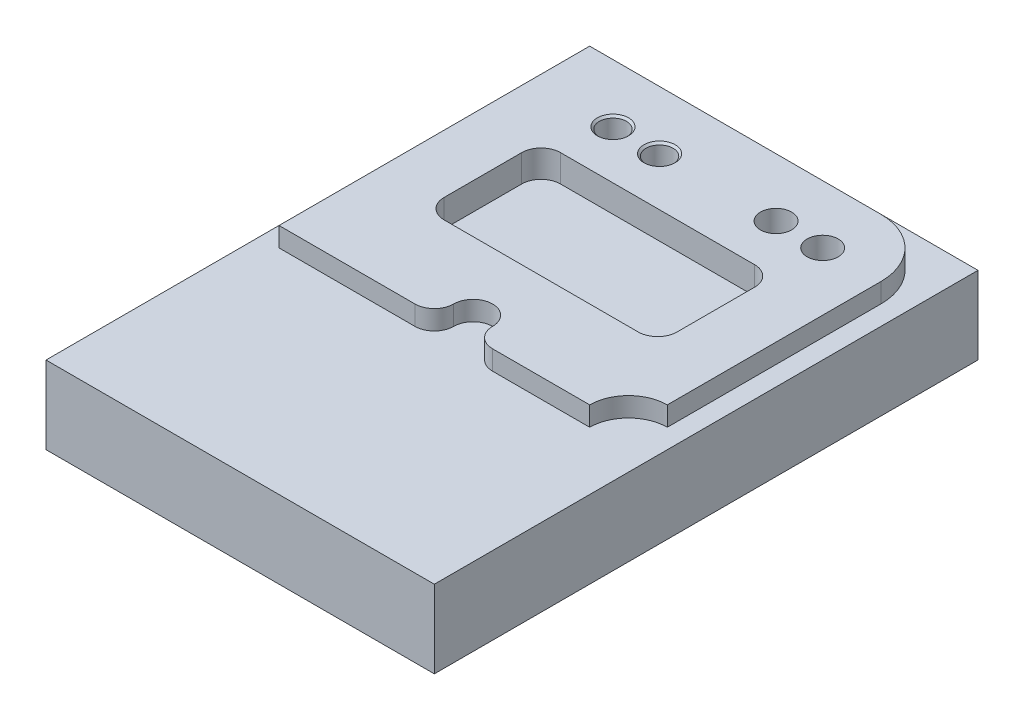
ISO-10303-21;
HEADER;
FILE_DESCRIPTION(('STEP AP214'),'2;1');
FILE_NAME('part.step','',(''),(''),'','','');
FILE_SCHEMA(('AUTOMOTIVE_DESIGN { 1 0 10303 214 1 1 1 1 }'));
ENDSEC;
DATA;
#1=APPLICATION_CONTEXT('core data for automotive mechanical design processes');
#2=APPLICATION_PROTOCOL_DEFINITION('international standard','automotive_design',2000,#1);
#3=PRODUCT_CONTEXT('',#1,'mechanical');
#4=PRODUCT('Part','Part','',(#3));
#5=PRODUCT_RELATED_PRODUCT_CATEGORY('part','',(#4));
#6=PRODUCT_DEFINITION_FORMATION('','',#4);
#7=PRODUCT_DEFINITION_CONTEXT('part definition',#1,'design');
#8=PRODUCT_DEFINITION('design','',#6,#7);
#9=PRODUCT_DEFINITION_SHAPE('','',#8);
#10=(LENGTH_UNIT() NAMED_UNIT(*) SI_UNIT(.MILLI.,.METRE.));
#11=(NAMED_UNIT(*) PLANE_ANGLE_UNIT() SI_UNIT($,.RADIAN.));
#12=(NAMED_UNIT(*) SI_UNIT($,.STERADIAN.) SOLID_ANGLE_UNIT());
#13=UNCERTAINTY_MEASURE_WITH_UNIT(LENGTH_MEASURE(1.E-05),#10,'distance_accuracy_value','');
#14=(GEOMETRIC_REPRESENTATION_CONTEXT(3) GLOBAL_UNCERTAINTY_ASSIGNED_CONTEXT((#13)) GLOBAL_UNIT_ASSIGNED_CONTEXT((#10,
#11,#12)) REPRESENTATION_CONTEXT('',''));
#15=CARTESIAN_POINT('',(0.,0.,0.));
#16=DIRECTION('',(0.,0.,1.));
#17=DIRECTION('',(1.,0.,0.));
#18=AXIS2_PLACEMENT_3D('',#15,#16,#17);
#19=CARTESIAN_POINT('',(-137.409638554217,25.,-148.222891566265));
#20=DIRECTION('',(-1.,0.,0.));
#21=DIRECTION('',(0.,0.,1.));
#22=AXIS2_PLACEMENT_3D('',#19,#20,#21);
#23=PLANE('',#22);
#24=DIRECTION('',(0.,-1.,0.));
#25=VECTOR('',#24,1.);
#26=CARTESIAN_POINT('',(-137.409638554217,25.,-148.222891566265));
#27=LINE('',#26,#25);
#28=CARTESIAN_POINT('',(-137.409638554217,20.,-148.222891566265));
#29=VERTEX_POINT('',#28);
#30=CARTESIAN_POINT('',(-137.409638554217,0.,-148.222891566265));
#31=VERTEX_POINT('',#30);
#32=EDGE_CURVE('E12',#29,#31,#27,.T.);
#33=ORIENTED_EDGE('',*,*,#32,.F.);
#34=DIRECTION('',(0.,0.,-1.));
#35=VECTOR('',#34,1.);
#36=CARTESIAN_POINT('',(-137.409638554217,20.,-63.2228915662651));
#37=LINE('',#36,#35);
#38=CARTESIAN_POINT('',(-137.409638554217,20.,-8.22289156626505));
#39=VERTEX_POINT('',#38);
#40=EDGE_CURVE('E401',#39,#29,#37,.T.);
#41=ORIENTED_EDGE('',*,*,#40,.F.);
#42=DIRECTION('',(0.,-1.,0.));
#43=VECTOR('',#42,1.);
#44=CARTESIAN_POINT('',(-137.409638554217,25.,-8.22289156626505));
#45=LINE('',#44,#43);
#46=CARTESIAN_POINT('',(-137.409638554217,0.,-8.22289156626505));
#47=VERTEX_POINT('',#46);
#48=EDGE_CURVE('E423',#39,#47,#45,.T.);
#49=ORIENTED_EDGE('',*,*,#48,.T.);
#50=DIRECTION('',(0.,0.,-1.));
#51=VECTOR('',#50,1.);
#52=CARTESIAN_POINT('',(-137.409638554217,0.,-148.222891566265));
#53=LINE('',#52,#51);
#54=EDGE_CURVE('E409',#47,#31,#53,.T.);
#55=ORIENTED_EDGE('',*,*,#54,.T.);
#56=EDGE_LOOP('',(#33,#41,#49,#55));
#57=FACE_BOUND('',#56,.T.);
#58=ADVANCED_FACE('F79',(#57),#23,.F.);
#59=CARTESIAN_POINT('',(-237.409638554217,25.,-148.222891566265));
#60=DIRECTION('',(0.,0.,1.));
#61=DIRECTION('',(1.,0.,0.));
#62=AXIS2_PLACEMENT_3D('',#59,#60,#61);
#63=PLANE('',#62);
#64=DIRECTION('',(-1.,0.,0.));
#65=VECTOR('',#64,1.);
#66=CARTESIAN_POINT('',(0.,20.,-148.222891566265));
#67=LINE('',#66,#65);
#68=CARTESIAN_POINT('',(-237.409638554217,20.,-148.222891566265));
#69=VERTEX_POINT('',#68);
#70=EDGE_CURVE('E361',#29,#69,#67,.T.);
#71=ORIENTED_EDGE('',*,*,#70,.F.);
#72=ORIENTED_EDGE('',*,*,#32,.T.);
#73=DIRECTION('',(-1.,0.,0.));
#74=VECTOR('',#73,1.);
#75=CARTESIAN_POINT('',(-237.409638554217,0.,-148.222891566265));
#76=LINE('',#75,#74);
#77=CARTESIAN_POINT('',(-237.409638554217,0.,-148.222891566265));
#78=VERTEX_POINT('',#77);
#79=EDGE_CURVE('E414',#31,#78,#76,.T.);
#80=ORIENTED_EDGE('',*,*,#79,.T.);
#81=DIRECTION('',(0.,-1.,0.));
#82=VECTOR('',#81,1.);
#83=CARTESIAN_POINT('',(-237.409638554217,25.,-148.222891566265));
#84=LINE('',#83,#82);
#85=EDGE_CURVE('E86',#69,#78,#84,.T.);
#86=ORIENTED_EDGE('',*,*,#85,.F.);
#87=EDGE_LOOP('',(#71,#72,#80,#86));
#88=FACE_BOUND('',#87,.T.);
#89=ADVANCED_FACE('F435',(#88),#63,.F.);
#90=CARTESIAN_POINT('',(-237.409638554217,25.,-148.222891566265));
#91=DIRECTION('',(1.,0.,0.));
#92=DIRECTION('',(0.,0.,-1.));
#93=AXIS2_PLACEMENT_3D('',#90,#91,#92);
#94=PLANE('',#93);
#95=DIRECTION('',(0.,0.,1.));
#96=VECTOR('',#95,1.);
#97=CARTESIAN_POINT('',(-237.409638554217,20.,-8.22289156626505));
#98=LINE('',#97,#96);
#99=CARTESIAN_POINT('',(-237.409638554217,20.,-8.22289156626505));
#100=VERTEX_POINT('',#99);
#101=EDGE_CURVE('E407',#69,#100,#98,.T.);
#102=ORIENTED_EDGE('',*,*,#101,.F.);
#103=ORIENTED_EDGE('',*,*,#85,.T.);
#104=DIRECTION('',(0.,0.,1.));
#105=VECTOR('',#104,1.);
#106=CARTESIAN_POINT('',(-237.409638554217,0.,-148.222891566265));
#107=LINE('',#106,#105);
#108=CARTESIAN_POINT('',(-237.409638554217,0.,-8.22289156626505));
#109=VERTEX_POINT('',#108);
#110=EDGE_CURVE('E417',#78,#109,#107,.T.);
#111=ORIENTED_EDGE('',*,*,#110,.T.);
#112=DIRECTION('',(0.,-1.,0.));
#113=VECTOR('',#112,1.);
#114=CARTESIAN_POINT('',(-237.409638554217,25.,-8.22289156626505));
#115=LINE('',#114,#113);
#116=EDGE_CURVE('E425',#100,#109,#115,.T.);
#117=ORIENTED_EDGE('',*,*,#116,.F.);
#118=EDGE_LOOP('',(#102,#103,#111,#117));
#119=FACE_BOUND('',#118,.T.);
#120=ADVANCED_FACE('F428',(#119),#94,.F.);
#121=CARTESIAN_POINT('',(0.,25.,0.));
#122=DIRECTION('',(0.,1.,0.));
#123=DIRECTION('',(0.,0.,1.));
#124=AXIS2_PLACEMENT_3D('',#121,#122,#123);
#125=PLANE('',#124);
#126=DIRECTION('',(-1.,0.,0.));
#127=VECTOR('',#126,1.);
#128=CARTESIAN_POINT('',(0.,25.,-115.722891566265));
#129=LINE('',#128,#127);
#130=CARTESIAN_POINT('',(-162.409638554217,25.,-115.722891566265));
#131=VERTEX_POINT('',#130);
#132=CARTESIAN_POINT('',(-212.409638554217,25.,-115.722891566265));
#133=VERTEX_POINT('',#132);
#134=EDGE_CURVE('E93',#131,#133,#129,.T.);
#135=ORIENTED_EDGE('',*,*,#134,.F.);
#136=CARTESIAN_POINT('',(-162.409638554217,25.,-110.722891566265));
#137=DIRECTION('',(0.,1.,0.));
#138=DIRECTION('',(0.,0.,1.));
#139=AXIS2_PLACEMENT_3D('',#136,#137,#138);
#140=CIRCLE('',#139,5.);
#141=CARTESIAN_POINT('',(-157.409638554217,25.,-110.722891566265));
#142=VERTEX_POINT('',#141);
#143=EDGE_CURVE('E254',#142,#131,#140,.T.);
#144=ORIENTED_EDGE('',*,*,#143,.F.);
#145=DIRECTION('',(0.,0.,-1.));
#146=VECTOR('',#145,1.);
#147=CARTESIAN_POINT('',(-157.409638554217,25.,0.));
#148=LINE('',#147,#146);
#149=CARTESIAN_POINT('',(-157.409638554217,25.,-90.7228915662651));
#150=VERTEX_POINT('',#149);
#151=EDGE_CURVE('E257',#150,#142,#148,.T.);
#152=ORIENTED_EDGE('',*,*,#151,.F.);
#153=CARTESIAN_POINT('',(-162.409638554217,25.,-90.722891566265));
#154=DIRECTION('',(0.,1.,0.));
#155=DIRECTION('',(0.,0.,1.));
#156=AXIS2_PLACEMENT_3D('',#153,#154,#155);
#157=CIRCLE('',#156,5.);
#158=CARTESIAN_POINT('',(-162.409638554217,25.,-85.722891566265));
#159=VERTEX_POINT('',#158);
#160=EDGE_CURVE('E283',#150,#159,#157,.F.);
#161=ORIENTED_EDGE('',*,*,#160,.T.);
#162=DIRECTION('',(-1.,0.,0.));
#163=VECTOR('',#162,1.);
#164=CARTESIAN_POINT('',(0.,25.,-85.7228915662651));
#165=LINE('',#164,#163);
#166=CARTESIAN_POINT('',(-212.409638554217,25.,-85.722891566265));
#167=VERTEX_POINT('',#166);
#168=EDGE_CURVE('E280',#159,#167,#165,.T.);
#169=ORIENTED_EDGE('',*,*,#168,.T.);
#170=CARTESIAN_POINT('',(-212.409638554217,25.,-90.722891566265));
#171=DIRECTION('',(0.,1.,0.));
#172=DIRECTION('',(0.,0.,1.));
#173=AXIS2_PLACEMENT_3D('',#170,#171,#172);
#174=CIRCLE('',#173,5.);
#175=CARTESIAN_POINT('',(-217.409638554217,25.,-90.722891566265));
#176=VERTEX_POINT('',#175);
#177=EDGE_CURVE('E277',#176,#167,#174,.T.);
#178=ORIENTED_EDGE('',*,*,#177,.F.);
#179=DIRECTION('',(0.,0.,-1.));
#180=VECTOR('',#179,1.);
#181=CARTESIAN_POINT('',(-217.409638554217,25.,0.));
#182=LINE('',#181,#180);
#183=CARTESIAN_POINT('',(-217.409638554217,25.,-110.722891566265));
#184=VERTEX_POINT('',#183);
#185=EDGE_CURVE('E274',#176,#184,#182,.T.);
#186=ORIENTED_EDGE('',*,*,#185,.T.);
#187=CARTESIAN_POINT('',(-212.409638554217,25.,-110.722891566265));
#188=DIRECTION('',(0.,1.,0.));
#189=DIRECTION('',(0.,0.,1.));
#190=AXIS2_PLACEMENT_3D('',#187,#188,#189);
#191=CIRCLE('',#190,5.);
#192=EDGE_CURVE('E272',#133,#184,#191,.T.);
#193=ORIENTED_EDGE('',*,*,#192,.F.);
#194=EDGE_LOOP('',(#135,#144,#152,#161,#169,#178,#186,#193));
#195=FACE_BOUND('',#194,.T.);
#196=CARTESIAN_POINT('',(-211.409638554217,25.,-128.222891566265));
#197=DIRECTION('',(0.,1.,0.));
#198=DIRECTION('',(0.,0.,1.));
#199=AXIS2_PLACEMENT_3D('',#196,#197,#198);
#200=CIRCLE('',#199,4.025);
#201=CARTESIAN_POINT('',(-211.409638554217,25.,-124.197891566265));
#202=VERTEX_POINT('',#201);
#203=EDGE_CURVE('E290',#202,#202,#200,.T.);
#204=ORIENTED_EDGE('',*,*,#203,.F.);
#205=EDGE_LOOP('',(#204));
#206=FACE_BOUND('',#205,.T.);
#207=CARTESIAN_POINT('',(-199.409638554217,25.,-128.222891566265));
#208=DIRECTION('',(0.,1.,0.));
#209=DIRECTION('',(0.,0.,1.));
#210=AXIS2_PLACEMENT_3D('',#207,#208,#209);
#211=CIRCLE('',#210,4.025);
#212=CARTESIAN_POINT('',(-199.409638554217,25.,-124.197891566265));
#213=VERTEX_POINT('',#212);
#214=EDGE_CURVE('E310',#213,#213,#211,.T.);
#215=ORIENTED_EDGE('',*,*,#214,.F.);
#216=EDGE_LOOP('',(#215));
#217=FACE_BOUND('',#216,.T.);
#218=CARTESIAN_POINT('',(-169.409638554217,25.,-128.222891566265));
#219=DIRECTION('',(0.,1.,0.));
#220=DIRECTION('',(0.,0.,1.));
#221=AXIS2_PLACEMENT_3D('',#218,#219,#220);
#222=CIRCLE('',#221,3.99999999999999);
#223=CARTESIAN_POINT('',(-169.409638554217,25.,-124.222891566265));
#224=VERTEX_POINT('',#223);
#225=EDGE_CURVE('E324',#224,#224,#222,.T.);
#226=ORIENTED_EDGE('',*,*,#225,.F.);
#227=EDGE_LOOP('',(#226));
#228=FACE_BOUND('',#227,.T.);
#229=CARTESIAN_POINT('',(-157.409638554217,25.,-128.222891566265));
#230=DIRECTION('',(0.,1.,0.));
#231=DIRECTION('',(0.,0.,1.));
#232=AXIS2_PLACEMENT_3D('',#229,#230,#231);
#233=CIRCLE('',#232,3.99999999999999);
#234=CARTESIAN_POINT('',(-157.409638554217,25.,-124.222891566265));
#235=VERTEX_POINT('',#234);
#236=EDGE_CURVE('E327',#235,#235,#233,.T.);
#237=ORIENTED_EDGE('',*,*,#236,.F.);
#238=EDGE_LOOP('',(#237));
#239=FACE_BOUND('',#238,.T.);
#240=CARTESIAN_POINT('',(-187.409638554217,25.,-68.2228915662651));
#241=DIRECTION('',(0.,1.,0.));
#242=DIRECTION('',(0.,0.,1.));
#243=AXIS2_PLACEMENT_3D('',#240,#241,#242);
#244=CIRCLE('',#243,4.99999999999998);
#245=CARTESIAN_POINT('',(-182.409638554217,25.,-68.2228915662651));
#246=VERTEX_POINT('',#245);
#247=CARTESIAN_POINT('',(-192.409638554217,25.,-68.2228915662651));
#248=VERTEX_POINT('',#247);
#249=EDGE_CURVE('E341',#246,#248,#244,.T.);
#250=ORIENTED_EDGE('',*,*,#249,.F.);
#251=CARTESIAN_POINT('',(-177.409638554217,25.,-68.2228915662651));
#252=DIRECTION('',(0.,1.,0.));
#253=DIRECTION('',(0.,0.,1.));
#254=AXIS2_PLACEMENT_3D('',#251,#252,#253);
#255=CIRCLE('',#254,5.00000000000002);
#256=CARTESIAN_POINT('',(-177.409638554217,25.,-63.2228915662651));
#257=VERTEX_POINT('',#256);
#258=EDGE_CURVE('E323',#246,#257,#255,.T.);
#259=ORIENTED_EDGE('',*,*,#258,.T.);
#260=DIRECTION('',(-1.,0.,0.));
#261=VECTOR('',#260,1.);
#262=CARTESIAN_POINT('',(-237.409638554217,25.,-63.2228915662651));
#263=LINE('',#262,#261);
#264=CARTESIAN_POINT('',(-152.409638554217,25.,-63.2228915662651));
#265=VERTEX_POINT('',#264);
#266=EDGE_CURVE('E402',#265,#257,#263,.T.);
#267=ORIENTED_EDGE('',*,*,#266,.F.);
#268=CARTESIAN_POINT('',(-142.409638554217,25.,-63.2228915662651));
#269=DIRECTION('',(0.,1.,0.));
#270=DIRECTION('',(0.,0.,1.));
#271=AXIS2_PLACEMENT_3D('',#268,#269,#270);
#272=CIRCLE('',#271,9.99999999999999);
#273=CARTESIAN_POINT('',(-142.409638554217,25.,-73.222891566265));
#274=VERTEX_POINT('',#273);
#275=EDGE_CURVE('E375',#274,#265,#272,.T.);
#276=ORIENTED_EDGE('',*,*,#275,.F.);
#277=DIRECTION('',(0.,0.,-1.));
#278=VECTOR('',#277,1.);
#279=CARTESIAN_POINT('',(-142.409638554217,25.,0.));
#280=LINE('',#279,#278);
#281=CARTESIAN_POINT('',(-142.409638554217,25.,-128.222891566265));
#282=VERTEX_POINT('',#281);
#283=EDGE_CURVE('E348',#274,#282,#280,.T.);
#284=ORIENTED_EDGE('',*,*,#283,.T.);
#285=CARTESIAN_POINT('',(-157.409638554217,25.,-128.222891566265));
#286=DIRECTION('',(0.,1.,0.));
#287=DIRECTION('',(0.,0.,1.));
#288=AXIS2_PLACEMENT_3D('',#285,#286,#287);
#289=CIRCLE('',#288,15.);
#290=CARTESIAN_POINT('',(-157.409638554217,25.,-143.222891566265));
#291=VERTEX_POINT('',#290);
#292=EDGE_CURVE('E359',#282,#291,#289,.T.);
#293=ORIENTED_EDGE('',*,*,#292,.T.);
#294=DIRECTION('',(1.,0.,0.));
#295=VECTOR('',#294,1.);
#296=CARTESIAN_POINT('',(0.,25.,-143.222891566265));
#297=LINE('',#296,#295);
#298=CARTESIAN_POINT('',(-232.409638554217,25.,-143.222891566265));
#299=VERTEX_POINT('',#298);
#300=EDGE_CURVE('E380',#299,#291,#297,.T.);
#301=ORIENTED_EDGE('',*,*,#300,.F.);
#302=DIRECTION('',(0.,0.,-1.));
#303=VECTOR('',#302,1.);
#304=CARTESIAN_POINT('',(-232.409638554217,25.,0.));
#305=LINE('',#304,#303);
#306=CARTESIAN_POINT('',(-232.409638554217,25.,-63.2228915662651));
#307=VERTEX_POINT('',#306);
#308=EDGE_CURVE('E377',#307,#299,#305,.T.);
#309=ORIENTED_EDGE('',*,*,#308,.F.);
#310=CARTESIAN_POINT('',(-197.409638554217,25.,-63.2228915662651));
#311=VERTEX_POINT('',#310);
#312=EDGE_CURVE('E388',#311,#307,#263,.T.);
#313=ORIENTED_EDGE('',*,*,#312,.F.);
#314=CARTESIAN_POINT('',(-197.409638554217,25.,-68.2228915662651));
#315=DIRECTION('',(0.,1.,0.));
#316=DIRECTION('',(0.,0.,1.));
#317=AXIS2_PLACEMENT_3D('',#314,#315,#316);
#318=CIRCLE('',#317,5.00000000000002);
#319=EDGE_CURVE('E335',#311,#248,#318,.T.);
#320=ORIENTED_EDGE('',*,*,#319,.T.);
#321=EDGE_LOOP('',(#250,#259,#267,#276,#284,#293,#301,#309,#313,#320));
#322=FACE_BOUND('',#321,.T.);
#323=ADVANCED_FACE('F455',(#195,#206,#217,#228,#239,#322),#125,.T.);
#324=CARTESIAN_POINT('',(-237.409638554217,20.,-63.2228915662651));
#325=DIRECTION('',(0.,0.,-1.));
#326=DIRECTION('',(-1.,0.,0.));
#327=AXIS2_PLACEMENT_3D('',#324,#325,#326);
#328=PLANE('',#327);
#329=DIRECTION('',(0.,1.,0.));
#330=VECTOR('',#329,1.);
#331=CARTESIAN_POINT('',(-177.409638554217,20.,-63.2228915662651));
#332=LINE('',#331,#330);
#333=CARTESIAN_POINT('',(-177.409638554217,20.,-63.2228915662651));
#334=VERTEX_POINT('',#333);
#335=EDGE_CURVE('E346',#334,#257,#332,.T.);
#336=ORIENTED_EDGE('',*,*,#335,.F.);
#337=DIRECTION('',(-1.,0.,0.));
#338=VECTOR('',#337,1.);
#339=CARTESIAN_POINT('',(-237.409638554217,20.,-63.2228915662651));
#340=LINE('',#339,#338);
#341=CARTESIAN_POINT('',(-152.409638554217,20.,-63.2228915662651));
#342=VERTEX_POINT('',#341);
#343=EDGE_CURVE('E406',#342,#334,#340,.T.);
#344=ORIENTED_EDGE('',*,*,#343,.F.);
#345=DIRECTION('',(0.,1.,0.));
#346=VECTOR('',#345,1.);
#347=CARTESIAN_POINT('',(-152.409638554217,20.,-63.2228915662651));
#348=LINE('',#347,#346);
#349=EDGE_CURVE('E395',#342,#265,#348,.T.);
#350=ORIENTED_EDGE('',*,*,#349,.T.);
#351=ORIENTED_EDGE('',*,*,#266,.T.);
#352=EDGE_LOOP('',(#336,#344,#350,#351));
#353=FACE_BOUND('',#352,.T.);
#354=ADVANCED_FACE('F460',(#353),#328,.F.);
#355=CARTESIAN_POINT('',(-237.409638554217,25.,-8.22289156626505));
#356=DIRECTION('',(0.,0.,-1.));
#357=DIRECTION('',(-1.,0.,0.));
#358=AXIS2_PLACEMENT_3D('',#355,#356,#357);
#359=PLANE('',#358);
#360=ORIENTED_EDGE('',*,*,#48,.F.);
#361=DIRECTION('',(1.,0.,0.));
#362=VECTOR('',#361,1.);
#363=CARTESIAN_POINT('',(-137.409638554217,20.,-8.22289156626505));
#364=LINE('',#363,#362);
#365=EDGE_CURVE('E399',#100,#39,#364,.T.);
#366=ORIENTED_EDGE('',*,*,#365,.F.);
#367=ORIENTED_EDGE('',*,*,#116,.T.);
#368=DIRECTION('',(1.,0.,0.));
#369=VECTOR('',#368,1.);
#370=CARTESIAN_POINT('',(-237.409638554217,0.,-8.22289156626505));
#371=LINE('',#370,#369);
#372=EDGE_CURVE('E420',#109,#47,#371,.T.);
#373=ORIENTED_EDGE('',*,*,#372,.T.);
#374=EDGE_LOOP('',(#360,#366,#367,#373));
#375=FACE_BOUND('',#374,.T.);
#376=ADVANCED_FACE('F442',(#375),#359,.F.);
#377=CARTESIAN_POINT('',(0.,0.,0.));
#378=DIRECTION('',(0.,1.,0.));
#379=DIRECTION('',(0.,0.,1.));
#380=AXIS2_PLACEMENT_3D('',#377,#378,#379);
#381=PLANE('',#380);
#382=ORIENTED_EDGE('',*,*,#54,.F.);
#383=ORIENTED_EDGE('',*,*,#372,.F.);
#384=ORIENTED_EDGE('',*,*,#110,.F.);
#385=ORIENTED_EDGE('',*,*,#79,.F.);
#386=EDGE_LOOP('',(#382,#383,#384,#385));
#387=FACE_BOUND('',#386,.T.);
#388=ADVANCED_FACE('F439',(#387),#381,.F.);
#389=CARTESIAN_POINT('',(-197.409638554217,20.,-63.2228915662651));
#390=VERTEX_POINT('',#389);
#391=CARTESIAN_POINT('',(-232.409638554217,20.,-63.2228915662651));
#392=VERTEX_POINT('',#391);
#393=EDGE_CURVE('E404',#390,#392,#340,.T.);
#394=ORIENTED_EDGE('',*,*,#393,.F.);
#395=DIRECTION('',(0.,1.,0.));
#396=VECTOR('',#395,1.);
#397=CARTESIAN_POINT('',(-197.409638554217,20.,-63.2228915662651));
#398=LINE('',#397,#396);
#399=EDGE_CURVE('E349',#390,#311,#398,.T.);
#400=ORIENTED_EDGE('',*,*,#399,.T.);
#401=ORIENTED_EDGE('',*,*,#312,.T.);
#402=DIRECTION('',(0.,1.,0.));
#403=VECTOR('',#402,1.);
#404=CARTESIAN_POINT('',(-232.409638554217,20.,-63.2228915662651));
#405=LINE('',#404,#403);
#406=EDGE_CURVE('E393',#392,#307,#405,.T.);
#407=ORIENTED_EDGE('',*,*,#406,.F.);
#408=EDGE_LOOP('',(#394,#400,#401,#407));
#409=FACE_BOUND('',#408,.T.);
#410=ADVANCED_FACE('F463',(#409),#328,.F.);
#411=CARTESIAN_POINT('',(0.,20.,0.));
#412=DIRECTION('',(0.,-1.,0.));
#413=DIRECTION('',(0.,0.,-1.));
#414=AXIS2_PLACEMENT_3D('',#411,#412,#413);
#415=PLANE('',#414);
#416=ORIENTED_EDGE('',*,*,#393,.T.);
#417=DIRECTION('',(0.,0.,-1.));
#418=VECTOR('',#417,1.);
#419=CARTESIAN_POINT('',(-232.409638554217,20.,0.));
#420=LINE('',#419,#418);
#421=CARTESIAN_POINT('',(-232.409638554217,20.,-143.222891566265));
#422=VERTEX_POINT('',#421);
#423=EDGE_CURVE('E364',#392,#422,#420,.T.);
#424=ORIENTED_EDGE('',*,*,#423,.T.);
#425=DIRECTION('',(1.,0.,0.));
#426=VECTOR('',#425,1.);
#427=CARTESIAN_POINT('',(0.,20.,-143.222891566265));
#428=LINE('',#427,#426);
#429=CARTESIAN_POINT('',(-157.409638554217,20.,-143.222891566265));
#430=VERTEX_POINT('',#429);
#431=EDGE_CURVE('E367',#422,#430,#428,.T.);
#432=ORIENTED_EDGE('',*,*,#431,.T.);
#433=CARTESIAN_POINT('',(-157.409638554217,20.,-128.222891566265));
#434=DIRECTION('',(0.,1.,0.));
#435=DIRECTION('',(0.,0.,1.));
#436=AXIS2_PLACEMENT_3D('',#433,#434,#435);
#437=CIRCLE('',#436,15.);
#438=CARTESIAN_POINT('',(-142.409638554217,20.,-128.222891566265));
#439=VERTEX_POINT('',#438);
#440=EDGE_CURVE('E370',#439,#430,#437,.T.);
#441=ORIENTED_EDGE('',*,*,#440,.F.);
#442=DIRECTION('',(0.,0.,-1.));
#443=VECTOR('',#442,1.);
#444=CARTESIAN_POINT('',(-142.409638554217,20.,0.));
#445=LINE('',#444,#443);
#446=CARTESIAN_POINT('',(-142.409638554217,20.,-73.222891566265));
#447=VERTEX_POINT('',#446);
#448=EDGE_CURVE('E355',#447,#439,#445,.T.);
#449=ORIENTED_EDGE('',*,*,#448,.F.);
#450=CARTESIAN_POINT('',(-142.409638554217,20.,-63.2228915662651));
#451=DIRECTION('',(0.,1.,0.));
#452=DIRECTION('',(0.,0.,1.));
#453=AXIS2_PLACEMENT_3D('',#450,#451,#452);
#454=CIRCLE('',#453,9.99999999999999);
#455=EDGE_CURVE('E358',#447,#342,#454,.T.);
#456=ORIENTED_EDGE('',*,*,#455,.T.);
#457=ORIENTED_EDGE('',*,*,#343,.T.);
#458=CARTESIAN_POINT('',(-177.409638554217,20.,-68.2228915662651));
#459=DIRECTION('',(0.,1.,0.));
#460=DIRECTION('',(0.,0.,1.));
#461=AXIS2_PLACEMENT_3D('',#458,#459,#460);
#462=CIRCLE('',#461,5.00000000000002);
#463=CARTESIAN_POINT('',(-182.409638554217,20.,-68.2228915662651));
#464=VERTEX_POINT('',#463);
#465=EDGE_CURVE('E332',#464,#334,#462,.T.);
#466=ORIENTED_EDGE('',*,*,#465,.F.);
#467=CARTESIAN_POINT('',(-187.409638554217,20.,-68.2228915662651));
#468=DIRECTION('',(0.,1.,0.));
#469=DIRECTION('',(0.,0.,1.));
#470=AXIS2_PLACEMENT_3D('',#467,#468,#469);
#471=CIRCLE('',#470,4.99999999999998);
#472=CARTESIAN_POINT('',(-192.409638554217,20.,-68.2228915662651));
#473=VERTEX_POINT('',#472);
#474=EDGE_CURVE('E334',#464,#473,#471,.T.);
#475=ORIENTED_EDGE('',*,*,#474,.T.);
#476=CARTESIAN_POINT('',(-197.409638554217,20.,-68.2228915662651));
#477=DIRECTION('',(0.,1.,0.));
#478=DIRECTION('',(0.,0.,1.));
#479=AXIS2_PLACEMENT_3D('',#476,#477,#478);
#480=CIRCLE('',#479,5.00000000000002);
#481=EDGE_CURVE('E101',#390,#473,#480,.T.);
#482=ORIENTED_EDGE('',*,*,#481,.F.);
#483=EDGE_LOOP('',(#416,#424,#432,#441,#449,#456,#457,#466,#475,#482));
#484=FACE_BOUND('',#483,.T.);
#485=ORIENTED_EDGE('',*,*,#365,.T.);
#486=ORIENTED_EDGE('',*,*,#40,.T.);
#487=ORIENTED_EDGE('',*,*,#70,.T.);
#488=ORIENTED_EDGE('',*,*,#101,.T.);
#489=EDGE_LOOP('',(#485,#486,#487,#488));
#490=FACE_BOUND('',#489,.T.);
#491=ADVANCED_FACE('F446',(#484,#490),#415,.F.);
#492=CARTESIAN_POINT('',(-142.409638554217,20.,0.));
#493=DIRECTION('',(1.,0.,0.));
#494=DIRECTION('',(0.,0.,-1.));
#495=AXIS2_PLACEMENT_3D('',#492,#493,#494);
#496=PLANE('',#495);
#497=ORIENTED_EDGE('',*,*,#283,.F.);
#498=DIRECTION('',(0.,1.,0.));
#499=VECTOR('',#498,1.);
#500=CARTESIAN_POINT('',(-142.409638554217,20.,-73.222891566265));
#501=LINE('',#500,#499);
#502=EDGE_CURVE('E372',#447,#274,#501,.T.);
#503=ORIENTED_EDGE('',*,*,#502,.F.);
#504=ORIENTED_EDGE('',*,*,#448,.T.);
#505=DIRECTION('',(0.,1.,0.));
#506=VECTOR('',#505,1.);
#507=CARTESIAN_POINT('',(-142.409638554217,20.,-128.222891566265));
#508=LINE('',#507,#506);
#509=EDGE_CURVE('E385',#439,#282,#508,.T.);
#510=ORIENTED_EDGE('',*,*,#509,.T.);
#511=EDGE_LOOP('',(#497,#503,#504,#510));
#512=FACE_BOUND('',#511,.T.);
#513=ADVANCED_FACE('F472',(#512),#496,.T.);
#514=CARTESIAN_POINT('',(-157.409638554217,20.,-128.222891566265));
#515=DIRECTION('',(0.,1.,0.));
#516=DIRECTION('',(0.,0.,1.));
#517=AXIS2_PLACEMENT_3D('',#514,#515,#516);
#518=CYLINDRICAL_SURFACE('',#517,15.);
#519=ORIENTED_EDGE('',*,*,#292,.F.);
#520=ORIENTED_EDGE('',*,*,#509,.F.);
#521=ORIENTED_EDGE('',*,*,#440,.T.);
#522=DIRECTION('',(0.,1.,0.));
#523=VECTOR('',#522,1.);
#524=CARTESIAN_POINT('',(-157.409638554217,20.,-143.222891566265));
#525=LINE('',#524,#523);
#526=EDGE_CURVE('E389',#430,#291,#525,.T.);
#527=ORIENTED_EDGE('',*,*,#526,.T.);
#528=EDGE_LOOP('',(#519,#520,#521,#527));
#529=FACE_BOUND('',#528,.T.);
#530=ADVANCED_FACE('F475',(#529),#518,.T.);
#531=CARTESIAN_POINT('',(0.,20.,-143.222891566265));
#532=DIRECTION('',(0.,0.,1.));
#533=DIRECTION('',(1.,0.,0.));
#534=AXIS2_PLACEMENT_3D('',#531,#532,#533);
#535=PLANE('',#534);
#536=ORIENTED_EDGE('',*,*,#300,.T.);
#537=ORIENTED_EDGE('',*,*,#526,.F.);
#538=ORIENTED_EDGE('',*,*,#431,.F.);
#539=DIRECTION('',(0.,1.,0.));
#540=VECTOR('',#539,1.);
#541=CARTESIAN_POINT('',(-232.409638554217,20.,-143.222891566265));
#542=LINE('',#541,#540);
#543=EDGE_CURVE('E391',#422,#299,#542,.T.);
#544=ORIENTED_EDGE('',*,*,#543,.T.);
#545=EDGE_LOOP('',(#536,#537,#538,#544));
#546=FACE_BOUND('',#545,.T.);
#547=ADVANCED_FACE('F485',(#546),#535,.F.);
#548=CARTESIAN_POINT('',(-232.409638554217,20.,0.));
#549=DIRECTION('',(1.,0.,0.));
#550=DIRECTION('',(0.,0.,-1.));
#551=AXIS2_PLACEMENT_3D('',#548,#549,#550);
#552=PLANE('',#551);
#553=ORIENTED_EDGE('',*,*,#308,.T.);
#554=ORIENTED_EDGE('',*,*,#543,.F.);
#555=ORIENTED_EDGE('',*,*,#423,.F.);
#556=ORIENTED_EDGE('',*,*,#406,.T.);
#557=EDGE_LOOP('',(#553,#554,#555,#556));
#558=FACE_BOUND('',#557,.T.);
#559=ADVANCED_FACE('F481',(#558),#552,.F.);
#560=CARTESIAN_POINT('',(-142.409638554217,20.,-63.2228915662651));
#561=DIRECTION('',(0.,1.,0.));
#562=DIRECTION('',(0.,0.,1.));
#563=AXIS2_PLACEMENT_3D('',#560,#561,#562);
#564=CYLINDRICAL_SURFACE('',#563,9.99999999999999);
#565=ORIENTED_EDGE('',*,*,#275,.T.);
#566=ORIENTED_EDGE('',*,*,#349,.F.);
#567=ORIENTED_EDGE('',*,*,#455,.F.);
#568=ORIENTED_EDGE('',*,*,#502,.T.);
#569=EDGE_LOOP('',(#565,#566,#567,#568));
#570=FACE_BOUND('',#569,.T.);
#571=ADVANCED_FACE('F477',(#570),#564,.F.);
#572=CARTESIAN_POINT('',(-177.409638554217,20.,-68.2228915662651));
#573=DIRECTION('',(0.,1.,0.));
#574=DIRECTION('',(0.,0.,1.));
#575=AXIS2_PLACEMENT_3D('',#572,#573,#574);
#576=CYLINDRICAL_SURFACE('',#575,5.00000000000002);
#577=ORIENTED_EDGE('',*,*,#258,.F.);
#578=DIRECTION('',(0.,1.,0.));
#579=VECTOR('',#578,1.);
#580=CARTESIAN_POINT('',(-182.409638554217,20.,-68.2228915662651));
#581=LINE('',#580,#579);
#582=EDGE_CURVE('E338',#464,#246,#581,.T.);
#583=ORIENTED_EDGE('',*,*,#582,.F.);
#584=ORIENTED_EDGE('',*,*,#465,.T.);
#585=ORIENTED_EDGE('',*,*,#335,.T.);
#586=EDGE_LOOP('',(#577,#583,#584,#585));
#587=FACE_BOUND('',#586,.T.);
#588=ADVANCED_FACE('F480',(#587),#576,.T.);
#589=CARTESIAN_POINT('',(-197.409638554217,20.,-68.2228915662651));
#590=DIRECTION('',(0.,1.,0.));
#591=DIRECTION('',(0.,0.,1.));
#592=AXIS2_PLACEMENT_3D('',#589,#590,#591);
#593=CYLINDRICAL_SURFACE('',#592,5.00000000000002);
#594=ORIENTED_EDGE('',*,*,#319,.F.);
#595=ORIENTED_EDGE('',*,*,#399,.F.);
#596=ORIENTED_EDGE('',*,*,#481,.T.);
#597=DIRECTION('',(0.,1.,0.));
#598=VECTOR('',#597,1.);
#599=CARTESIAN_POINT('',(-192.409638554217,20.,-68.2228915662651));
#600=LINE('',#599,#598);
#601=EDGE_CURVE('E352',#473,#248,#600,.T.);
#602=ORIENTED_EDGE('',*,*,#601,.T.);
#603=EDGE_LOOP('',(#594,#595,#596,#602));
#604=FACE_BOUND('',#603,.T.);
#605=ADVANCED_FACE('F495',(#604),#593,.T.);
#606=CARTESIAN_POINT('',(-187.409638554217,20.,-68.2228915662651));
#607=DIRECTION('',(0.,1.,0.));
#608=DIRECTION('',(0.,0.,1.));
#609=AXIS2_PLACEMENT_3D('',#606,#607,#608);
#610=CYLINDRICAL_SURFACE('',#609,4.99999999999998);
#611=ORIENTED_EDGE('',*,*,#249,.T.);
#612=ORIENTED_EDGE('',*,*,#601,.F.);
#613=ORIENTED_EDGE('',*,*,#474,.F.);
#614=ORIENTED_EDGE('',*,*,#582,.T.);
#615=EDGE_LOOP('',(#611,#612,#613,#614));
#616=FACE_BOUND('',#615,.T.);
#617=ADVANCED_FACE('F497',(#616),#610,.F.);
#618=CARTESIAN_POINT('',(-157.409638554217,15.,-128.222891566265));
#619=DIRECTION('',(0.,1.,0.));
#620=DIRECTION('',(0.,0.,1.));
#621=AXIS2_PLACEMENT_3D('',#618,#619,#620);
#622=CYLINDRICAL_SURFACE('',#621,3.99999999999999);
#623=CARTESIAN_POINT('',(-157.409638554217,15.,-128.222891566265));
#624=DIRECTION('',(0.,1.,0.));
#625=DIRECTION('',(0.,0.,1.));
#626=AXIS2_PLACEMENT_3D('',#623,#624,#625);
#627=CIRCLE('',#626,3.99999999999999);
#628=CARTESIAN_POINT('',(-157.409638554217,15.,-124.222891566265));
#629=VERTEX_POINT('',#628);
#630=EDGE_CURVE('E319',#629,#629,#627,.T.);
#631=ORIENTED_EDGE('',*,*,#630,.F.);
#632=EDGE_LOOP('',(#631));
#633=FACE_BOUND('',#632,.T.);
#634=ORIENTED_EDGE('',*,*,#236,.T.);
#635=EDGE_LOOP('',(#634));
#636=FACE_BOUND('',#635,.T.);
#637=ADVANCED_FACE('F500',(#633,#636),#622,.F.);
#638=CARTESIAN_POINT('',(-157.409638554217,15.,-128.222891566265));
#639=DIRECTION('',(0.,1.,0.));
#640=DIRECTION('',(0.,0.,1.));
#641=AXIS2_PLACEMENT_3D('',#638,#639,#640);
#642=PLANE('',#641);
#643=ORIENTED_EDGE('',*,*,#630,.T.);
#644=EDGE_LOOP('',(#643));
#645=FACE_BOUND('',#644,.T.);
#646=ADVANCED_FACE('F505',(#645),#642,.T.);
#647=CARTESIAN_POINT('',(-169.409638554217,15.,-128.222891566265));
#648=DIRECTION('',(0.,1.,0.));
#649=DIRECTION('',(0.,0.,1.));
#650=AXIS2_PLACEMENT_3D('',#647,#648,#649);
#651=CYLINDRICAL_SURFACE('',#650,3.99999999999999);
#652=CARTESIAN_POINT('',(-169.409638554217,15.,-128.222891566265));
#653=DIRECTION('',(0.,1.,0.));
#654=DIRECTION('',(0.,0.,1.));
#655=AXIS2_PLACEMENT_3D('',#652,#653,#654);
#656=CIRCLE('',#655,3.99999999999999);
#657=CARTESIAN_POINT('',(-169.409638554217,15.,-124.222891566265));
#658=VERTEX_POINT('',#657);
#659=EDGE_CURVE('E320',#658,#658,#656,.T.);
#660=ORIENTED_EDGE('',*,*,#659,.F.);
#661=EDGE_LOOP('',(#660));
#662=FACE_BOUND('',#661,.T.);
#663=ORIENTED_EDGE('',*,*,#225,.T.);
#664=EDGE_LOOP('',(#663));
#665=FACE_BOUND('',#664,.T.);
#666=ADVANCED_FACE('F508',(#662,#665),#651,.F.);
#667=CARTESIAN_POINT('',(0.,15.,0.));
#668=DIRECTION('',(0.,1.,0.));
#669=DIRECTION('',(0.,0.,1.));
#670=AXIS2_PLACEMENT_3D('',#667,#668,#669);
#671=PLANE('',#670);
#672=ORIENTED_EDGE('',*,*,#659,.T.);
#673=EDGE_LOOP('',(#672));
#674=FACE_BOUND('',#673,.T.);
#675=ADVANCED_FACE('F515',(#674),#671,.T.);
#676=CARTESIAN_POINT('',(-199.409638554217,12.1030121665965,-128.222891566265));
#677=DIRECTION('',(0.,1.,0.));
#678=DIRECTION('',(0.,0.,1.));
#679=AXIS2_PLACEMENT_3D('',#676,#677,#678);
#680=CONICAL_SURFACE('',#679,3.5,1.02974425867665);
#681=CARTESIAN_POINT('',(-199.409638554217,10.,-128.222891566265));
#682=VERTEX_POINT('',#681);
#683=VERTEX_LOOP('',#682);
#684=FACE_BOUND('',#683,.T.);
#685=CARTESIAN_POINT('',(-199.409638554217,12.1030121665965,-128.222891566265));
#686=DIRECTION('',(0.,1.,0.));
#687=DIRECTION('',(0.,0.,1.));
#688=AXIS2_PLACEMENT_3D('',#685,#686,#687);
#689=CIRCLE('',#688,3.5);
#690=CARTESIAN_POINT('',(-199.409638554217,12.1030121665965,-124.722891566265));
#691=VERTEX_POINT('',#690);
#692=EDGE_CURVE('E316',#691,#691,#689,.T.);
#693=ORIENTED_EDGE('',*,*,#692,.T.);
#694=EDGE_LOOP('',(#693));
#695=FACE_BOUND('',#694,.T.);
#696=ADVANCED_FACE('F519',(#684,#695),#680,.F.);
#697=CARTESIAN_POINT('',(-199.409638554217,25.,-128.222891566265));
#698=DIRECTION('',(0.,1.,0.));
#699=DIRECTION('',(0.,0.,1.));
#700=AXIS2_PLACEMENT_3D('',#697,#698,#699);
#701=CYLINDRICAL_SURFACE('',#700,3.5);
#702=ORIENTED_EDGE('',*,*,#692,.F.);
#703=EDGE_LOOP('',(#702));
#704=FACE_BOUND('',#703,.T.);
#705=CARTESIAN_POINT('',(-199.409638554217,24.475,-128.222891566265));
#706=DIRECTION('',(0.,1.,0.));
#707=DIRECTION('',(0.,0.,1.));
#708=AXIS2_PLACEMENT_3D('',#705,#706,#707);
#709=CIRCLE('',#708,3.5);
#710=CARTESIAN_POINT('',(-199.409638554217,24.475,-124.722891566265));
#711=VERTEX_POINT('',#710);
#712=EDGE_CURVE('E313',#711,#711,#709,.T.);
#713=ORIENTED_EDGE('',*,*,#712,.T.);
#714=EDGE_LOOP('',(#713));
#715=FACE_BOUND('',#714,.T.);
#716=ADVANCED_FACE('F523',(#704,#715),#701,.F.);
#717=CARTESIAN_POINT('',(-199.409638554217,25.,-128.222891566265));
#718=DIRECTION('',(0.,1.,0.));
#719=DIRECTION('',(0.,0.,1.));
#720=AXIS2_PLACEMENT_3D('',#717,#718,#719);
#721=CONICAL_SURFACE('',#720,4.025,0.785398163397445);
#722=ORIENTED_EDGE('',*,*,#712,.F.);
#723=EDGE_LOOP('',(#722));
#724=FACE_BOUND('',#723,.T.);
#725=ORIENTED_EDGE('',*,*,#214,.T.);
#726=EDGE_LOOP('',(#725));
#727=FACE_BOUND('',#726,.T.);
#728=ADVANCED_FACE('F527',(#724,#727),#721,.F.);
#729=CARTESIAN_POINT('',(-211.409638554217,12.1030121665965,-128.222891566265));
#730=DIRECTION('',(0.,1.,0.));
#731=DIRECTION('',(0.,0.,1.));
#732=AXIS2_PLACEMENT_3D('',#729,#730,#731);
#733=CONICAL_SURFACE('',#732,3.5,1.02974425867665);
#734=CARTESIAN_POINT('',(-211.409638554217,10.,-128.222891566265));
#735=VERTEX_POINT('',#734);
#736=VERTEX_LOOP('',#735);
#737=FACE_BOUND('',#736,.T.);
#738=CARTESIAN_POINT('',(-211.409638554217,12.1030121665965,-128.222891566265));
#739=DIRECTION('',(0.,1.,0.));
#740=DIRECTION('',(0.,0.,1.));
#741=AXIS2_PLACEMENT_3D('',#738,#739,#740);
#742=CIRCLE('',#741,3.5);
#743=CARTESIAN_POINT('',(-211.409638554217,12.1030121665965,-124.722891566265));
#744=VERTEX_POINT('',#743);
#745=EDGE_CURVE('E307',#744,#744,#742,.T.);
#746=ORIENTED_EDGE('',*,*,#745,.T.);
#747=EDGE_LOOP('',(#746));
#748=FACE_BOUND('',#747,.T.);
#749=ADVANCED_FACE('F531',(#737,#748),#733,.F.);
#750=CARTESIAN_POINT('',(-211.409638554217,25.,-128.222891566265));
#751=DIRECTION('',(0.,1.,0.));
#752=DIRECTION('',(0.,0.,1.));
#753=AXIS2_PLACEMENT_3D('',#750,#751,#752);
#754=CYLINDRICAL_SURFACE('',#753,3.5);
#755=ORIENTED_EDGE('',*,*,#745,.F.);
#756=EDGE_LOOP('',(#755));
#757=FACE_BOUND('',#756,.T.);
#758=CARTESIAN_POINT('',(-211.409638554217,24.475,-128.222891566265));
#759=DIRECTION('',(0.,1.,0.));
#760=DIRECTION('',(0.,0.,1.));
#761=AXIS2_PLACEMENT_3D('',#758,#759,#760);
#762=CIRCLE('',#761,3.5);
#763=CARTESIAN_POINT('',(-211.409638554217,24.475,-124.722891566265));
#764=VERTEX_POINT('',#763);
#765=EDGE_CURVE('E304',#764,#764,#762,.T.);
#766=ORIENTED_EDGE('',*,*,#765,.T.);
#767=EDGE_LOOP('',(#766));
#768=FACE_BOUND('',#767,.T.);
#769=ADVANCED_FACE('F535',(#757,#768),#754,.F.);
#770=CARTESIAN_POINT('',(-211.409638554217,25.,-128.222891566265));
#771=DIRECTION('',(0.,1.,0.));
#772=DIRECTION('',(0.,0.,1.));
#773=AXIS2_PLACEMENT_3D('',#770,#771,#772);
#774=CONICAL_SURFACE('',#773,4.025,0.785398163397445);
#775=ORIENTED_EDGE('',*,*,#765,.F.);
#776=EDGE_LOOP('',(#775));
#777=FACE_BOUND('',#776,.T.);
#778=ORIENTED_EDGE('',*,*,#203,.T.);
#779=EDGE_LOOP('',(#778));
#780=FACE_BOUND('',#779,.T.);
#781=ADVANCED_FACE('F539',(#777,#780),#774,.F.);
#782=CARTESIAN_POINT('',(0.,18.,-115.722891566265));
#783=DIRECTION('',(0.,0.,-1.));
#784=DIRECTION('',(-1.,0.,0.));
#785=AXIS2_PLACEMENT_3D('',#782,#783,#784);
#786=PLANE('',#785);
#787=ORIENTED_EDGE('',*,*,#134,.T.);
#788=DIRECTION('',(0.,1.,0.));
#789=VECTOR('',#788,1.);
#790=CARTESIAN_POINT('',(-212.409638554217,18.,-115.722891566265));
#791=LINE('',#790,#789);
#792=CARTESIAN_POINT('',(-212.409638554217,18.,-115.722891566265));
#793=VERTEX_POINT('',#792);
#794=EDGE_CURVE('E231',#793,#133,#791,.T.);
#795=ORIENTED_EDGE('',*,*,#794,.F.);
#796=DIRECTION('',(-1.,0.,0.));
#797=VECTOR('',#796,1.);
#798=CARTESIAN_POINT('',(0.,18.,-115.722891566265));
#799=LINE('',#798,#797);
#800=CARTESIAN_POINT('',(-162.409638554217,18.,-115.722891566265));
#801=VERTEX_POINT('',#800);
#802=EDGE_CURVE('E235',#801,#793,#799,.T.);
#803=ORIENTED_EDGE('',*,*,#802,.F.);
#804=DIRECTION('',(0.,1.,0.));
#805=VECTOR('',#804,1.);
#806=CARTESIAN_POINT('',(-162.409638554217,18.,-115.722891566265));
#807=LINE('',#806,#805);
#808=EDGE_CURVE('E288',#801,#131,#807,.T.);
#809=ORIENTED_EDGE('',*,*,#808,.T.);
#810=EDGE_LOOP('',(#787,#795,#803,#809));
#811=FACE_BOUND('',#810,.T.);
#812=ADVANCED_FACE('F233',(#811),#786,.F.);
#813=CARTESIAN_POINT('',(-162.409638554217,18.,-110.722891566265));
#814=DIRECTION('',(0.,1.,0.));
#815=DIRECTION('',(0.,0.,1.));
#816=AXIS2_PLACEMENT_3D('',#813,#814,#815);
#817=CYLINDRICAL_SURFACE('',#816,5.);
#818=ORIENTED_EDGE('',*,*,#143,.T.);
#819=ORIENTED_EDGE('',*,*,#808,.F.);
#820=CARTESIAN_POINT('',(-162.409638554217,18.,-110.722891566265));
#821=DIRECTION('',(0.,1.,0.));
#822=DIRECTION('',(0.,0.,1.));
#823=AXIS2_PLACEMENT_3D('',#820,#821,#822);
#824=CIRCLE('',#823,5.);
#825=CARTESIAN_POINT('',(-157.409638554217,18.,-110.722891566265));
#826=VERTEX_POINT('',#825);
#827=EDGE_CURVE('E241',#826,#801,#824,.T.);
#828=ORIENTED_EDGE('',*,*,#827,.F.);
#829=DIRECTION('',(0.,1.,0.));
#830=VECTOR('',#829,1.);
#831=CARTESIAN_POINT('',(-157.409638554217,18.,-110.722891566265));
#832=LINE('',#831,#830);
#833=EDGE_CURVE('E291',#826,#142,#832,.T.);
#834=ORIENTED_EDGE('',*,*,#833,.T.);
#835=EDGE_LOOP('',(#818,#819,#828,#834));
#836=FACE_BOUND('',#835,.T.);
#837=ADVANCED_FACE('F546',(#836),#817,.F.);
#838=CARTESIAN_POINT('',(-157.409638554217,18.,0.));
#839=DIRECTION('',(1.,0.,0.));
#840=DIRECTION('',(0.,0.,-1.));
#841=AXIS2_PLACEMENT_3D('',#838,#839,#840);
#842=PLANE('',#841);
#843=ORIENTED_EDGE('',*,*,#151,.T.);
#844=ORIENTED_EDGE('',*,*,#833,.F.);
#845=DIRECTION('',(0.,0.,-1.));
#846=VECTOR('',#845,1.);
#847=CARTESIAN_POINT('',(-157.409638554217,18.,0.));
#848=LINE('',#847,#846);
#849=CARTESIAN_POINT('',(-157.409638554217,18.,-90.7228915662651));
#850=VERTEX_POINT('',#849);
#851=EDGE_CURVE('E268',#850,#826,#848,.T.);
#852=ORIENTED_EDGE('',*,*,#851,.F.);
#853=DIRECTION('',(0.,1.,0.));
#854=VECTOR('',#853,1.);
#855=CARTESIAN_POINT('',(-157.409638554217,18.,-90.7228915662651));
#856=LINE('',#855,#854);
#857=EDGE_CURVE('E293',#850,#150,#856,.T.);
#858=ORIENTED_EDGE('',*,*,#857,.T.);
#859=EDGE_LOOP('',(#843,#844,#852,#858));
#860=FACE_BOUND('',#859,.T.);
#861=ADVANCED_FACE('F564',(#860),#842,.F.);
#862=CARTESIAN_POINT('',(-162.409638554217,18.,-90.722891566265));
#863=DIRECTION('',(0.,1.,0.));
#864=DIRECTION('',(0.,0.,1.));
#865=AXIS2_PLACEMENT_3D('',#862,#863,#864);
#866=CYLINDRICAL_SURFACE('',#865,5.);
#867=ORIENTED_EDGE('',*,*,#160,.F.);
#868=ORIENTED_EDGE('',*,*,#857,.F.);
#869=CARTESIAN_POINT('',(-162.409638554217,18.,-90.722891566265));
#870=DIRECTION('',(0.,1.,0.));
#871=DIRECTION('',(0.,0.,1.));
#872=AXIS2_PLACEMENT_3D('',#869,#870,#871);
#873=CIRCLE('',#872,5.);
#874=CARTESIAN_POINT('',(-162.409638554217,18.,-85.722891566265));
#875=VERTEX_POINT('',#874);
#876=EDGE_CURVE('E266',#850,#875,#873,.F.);
#877=ORIENTED_EDGE('',*,*,#876,.T.);
#878=DIRECTION('',(0.,1.,0.));
#879=VECTOR('',#878,1.);
#880=CARTESIAN_POINT('',(-162.409638554217,18.,-85.722891566265));
#881=LINE('',#880,#879);
#882=EDGE_CURVE('E295',#875,#159,#881,.T.);
#883=ORIENTED_EDGE('',*,*,#882,.T.);
#884=EDGE_LOOP('',(#867,#868,#877,#883));
#885=FACE_BOUND('',#884,.T.);
#886=ADVANCED_FACE('F560',(#885),#866,.F.);
#887=CARTESIAN_POINT('',(0.,18.,-85.7228915662651));
#888=DIRECTION('',(0.,0.,-1.));
#889=DIRECTION('',(-1.,0.,0.));
#890=AXIS2_PLACEMENT_3D('',#887,#888,#889);
#891=PLANE('',#890);
#892=ORIENTED_EDGE('',*,*,#168,.F.);
#893=ORIENTED_EDGE('',*,*,#882,.F.);
#894=DIRECTION('',(-1.,0.,0.));
#895=VECTOR('',#894,1.);
#896=CARTESIAN_POINT('',(0.,18.,-85.7228915662651));
#897=LINE('',#896,#895);
#898=CARTESIAN_POINT('',(-212.409638554217,18.,-85.722891566265));
#899=VERTEX_POINT('',#898);
#900=EDGE_CURVE('E264',#875,#899,#897,.T.);
#901=ORIENTED_EDGE('',*,*,#900,.T.);
#902=DIRECTION('',(0.,1.,0.));
#903=VECTOR('',#902,1.);
#904=CARTESIAN_POINT('',(-212.409638554217,18.,-85.722891566265));
#905=LINE('',#904,#903);
#906=EDGE_CURVE('E297',#899,#167,#905,.T.);
#907=ORIENTED_EDGE('',*,*,#906,.T.);
#908=EDGE_LOOP('',(#892,#893,#901,#907));
#909=FACE_BOUND('',#908,.T.);
#910=ADVANCED_FACE('F556',(#909),#891,.T.);
#911=CARTESIAN_POINT('',(-212.409638554217,18.,-90.722891566265));
#912=DIRECTION('',(0.,1.,0.));
#913=DIRECTION('',(0.,0.,1.));
#914=AXIS2_PLACEMENT_3D('',#911,#912,#913);
#915=CYLINDRICAL_SURFACE('',#914,5.);
#916=ORIENTED_EDGE('',*,*,#177,.T.);
#917=ORIENTED_EDGE('',*,*,#906,.F.);
#918=CARTESIAN_POINT('',(-212.409638554217,18.,-90.722891566265));
#919=DIRECTION('',(0.,1.,0.));
#920=DIRECTION('',(0.,0.,1.));
#921=AXIS2_PLACEMENT_3D('',#918,#919,#920);
#922=CIRCLE('',#921,5.);
#923=CARTESIAN_POINT('',(-217.409638554217,18.,-90.722891566265));
#924=VERTEX_POINT('',#923);
#925=EDGE_CURVE('E261',#924,#899,#922,.T.);
#926=ORIENTED_EDGE('',*,*,#925,.F.);
#927=DIRECTION('',(0.,1.,0.));
#928=VECTOR('',#927,1.);
#929=CARTESIAN_POINT('',(-217.409638554217,18.,-90.722891566265));
#930=LINE('',#929,#928);
#931=EDGE_CURVE('E299',#924,#176,#930,.T.);
#932=ORIENTED_EDGE('',*,*,#931,.T.);
#933=EDGE_LOOP('',(#916,#917,#926,#932));
#934=FACE_BOUND('',#933,.T.);
#935=ADVANCED_FACE('F552',(#934),#915,.F.);
#936=CARTESIAN_POINT('',(-217.409638554217,18.,0.));
#937=DIRECTION('',(1.,0.,0.));
#938=DIRECTION('',(0.,0.,-1.));
#939=AXIS2_PLACEMENT_3D('',#936,#937,#938);
#940=PLANE('',#939);
#941=ORIENTED_EDGE('',*,*,#185,.F.);
#942=ORIENTED_EDGE('',*,*,#931,.F.);
#943=DIRECTION('',(0.,0.,-1.));
#944=VECTOR('',#943,1.);
#945=CARTESIAN_POINT('',(-217.409638554217,18.,0.));
#946=LINE('',#945,#944);
#947=CARTESIAN_POINT('',(-217.409638554217,18.,-110.722891566265));
#948=VERTEX_POINT('',#947);
#949=EDGE_CURVE('E249',#924,#948,#946,.T.);
#950=ORIENTED_EDGE('',*,*,#949,.T.);
#951=DIRECTION('',(0.,1.,0.));
#952=VECTOR('',#951,1.);
#953=CARTESIAN_POINT('',(-217.409638554217,18.,-110.722891566265));
#954=LINE('',#953,#952);
#955=EDGE_CURVE('E240',#948,#184,#954,.T.);
#956=ORIENTED_EDGE('',*,*,#955,.T.);
#957=EDGE_LOOP('',(#941,#942,#950,#956));
#958=FACE_BOUND('',#957,.T.);
#959=ADVANCED_FACE('F549',(#958),#940,.T.);
#960=CARTESIAN_POINT('',(-212.409638554217,18.,-110.722891566265));
#961=DIRECTION('',(0.,1.,0.));
#962=DIRECTION('',(0.,0.,1.));
#963=AXIS2_PLACEMENT_3D('',#960,#961,#962);
#964=CYLINDRICAL_SURFACE('',#963,5.);
#965=ORIENTED_EDGE('',*,*,#192,.T.);
#966=ORIENTED_EDGE('',*,*,#955,.F.);
#967=CARTESIAN_POINT('',(-212.409638554217,18.,-110.722891566265));
#968=DIRECTION('',(0.,1.,0.));
#969=DIRECTION('',(0.,0.,1.));
#970=AXIS2_PLACEMENT_3D('',#967,#968,#969);
#971=CIRCLE('',#970,5.);
#972=EDGE_CURVE('E245',#793,#948,#971,.T.);
#973=ORIENTED_EDGE('',*,*,#972,.F.);
#974=ORIENTED_EDGE('',*,*,#794,.T.);
#975=EDGE_LOOP('',(#965,#966,#973,#974));
#976=FACE_BOUND('',#975,.T.);
#977=ADVANCED_FACE('F246',(#976),#964,.F.);
#978=CARTESIAN_POINT('',(0.,18.,0.));
#979=DIRECTION('',(0.,1.,0.));
#980=DIRECTION('',(0.,0.,1.));
#981=AXIS2_PLACEMENT_3D('',#978,#979,#980);
#982=PLANE('',#981);
#983=ORIENTED_EDGE('',*,*,#802,.T.);
#984=ORIENTED_EDGE('',*,*,#972,.T.);
#985=ORIENTED_EDGE('',*,*,#949,.F.);
#986=ORIENTED_EDGE('',*,*,#925,.T.);
#987=ORIENTED_EDGE('',*,*,#900,.F.);
#988=ORIENTED_EDGE('',*,*,#876,.F.);
#989=ORIENTED_EDGE('',*,*,#851,.T.);
#990=ORIENTED_EDGE('',*,*,#827,.T.);
#991=EDGE_LOOP('',(#983,#984,#985,#986,#987,#988,#989,#990));
#992=FACE_BOUND('',#991,.T.);
#993=ADVANCED_FACE('F251',(#992),#982,.T.);
#994=CLOSED_SHELL('',(#58,#89,#120,#323,#354,#376,#388,#410,#491,#513,#530,#547,#559,#571,#588,
#605,#617,#637,#646,#666,#675,#696,#716,#728,#749,#769,#781,#812,#837,#861,#886,#910,#935,#959,
#977,#993));
#995=MANIFOLD_SOLID_BREP('B2',#994);
#996=ADVANCED_BREP_SHAPE_REPRESENTATION('',(#18,#995),#14);
#997=SHAPE_DEFINITION_REPRESENTATION(#9,#996);
ENDSEC;
END-ISO-10303-21;
